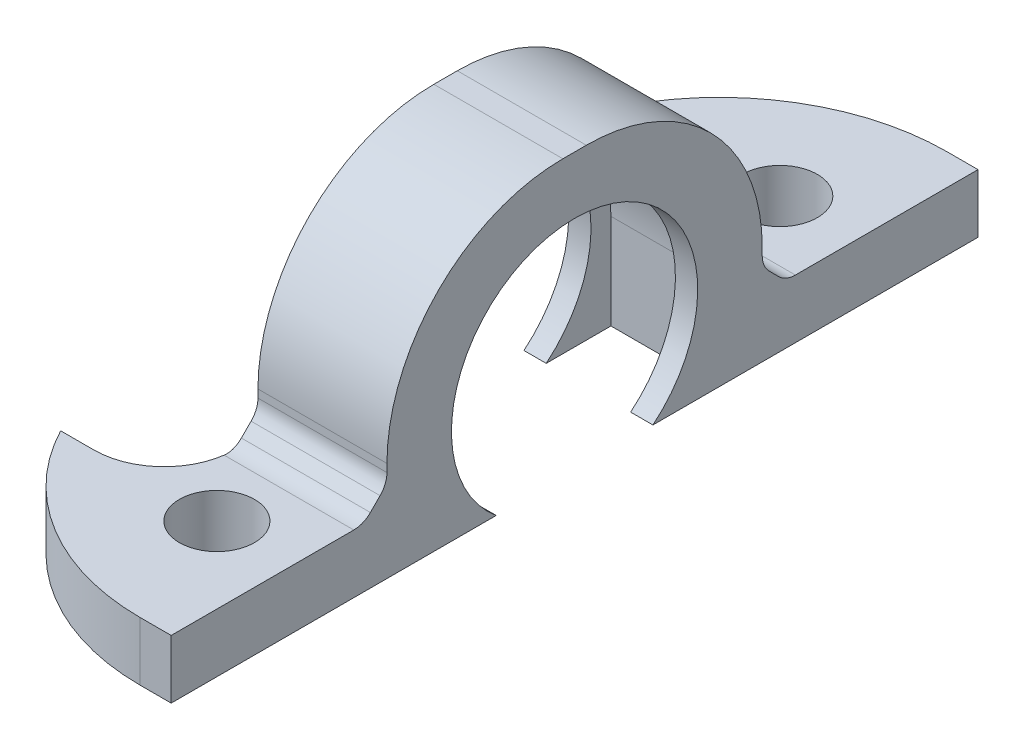
ISO-10303-21;
HEADER;
FILE_DESCRIPTION(('STEP AP214'),'2;1');
FILE_NAME('part.step','',(''),(''),'','','');
FILE_SCHEMA(('AUTOMOTIVE_DESIGN { 1 0 10303 214 1 1 1 1 }'));
ENDSEC;
DATA;
#1=APPLICATION_CONTEXT('core data for automotive mechanical design processes');
#2=APPLICATION_PROTOCOL_DEFINITION('international standard','automotive_design',2000,#1);
#3=PRODUCT_CONTEXT('',#1,'mechanical');
#4=PRODUCT('Part','Part','',(#3));
#5=PRODUCT_RELATED_PRODUCT_CATEGORY('part','',(#4));
#6=PRODUCT_DEFINITION_FORMATION('','',#4);
#7=PRODUCT_DEFINITION_CONTEXT('part definition',#1,'design');
#8=PRODUCT_DEFINITION('design','',#6,#7);
#9=PRODUCT_DEFINITION_SHAPE('','',#8);
#10=(LENGTH_UNIT() NAMED_UNIT(*) SI_UNIT(.MILLI.,.METRE.));
#11=(NAMED_UNIT(*) PLANE_ANGLE_UNIT() SI_UNIT($,.RADIAN.));
#12=(NAMED_UNIT(*) SI_UNIT($,.STERADIAN.) SOLID_ANGLE_UNIT());
#13=UNCERTAINTY_MEASURE_WITH_UNIT(LENGTH_MEASURE(1.E-05),#10,'distance_accuracy_value','');
#14=(GEOMETRIC_REPRESENTATION_CONTEXT(3) GLOBAL_UNCERTAINTY_ASSIGNED_CONTEXT((#13)) GLOBAL_UNIT_ASSIGNED_CONTEXT((#10,
#11,#12)) REPRESENTATION_CONTEXT('',''));
#15=CARTESIAN_POINT('',(0.,0.,0.));
#16=DIRECTION('',(0.,0.,1.));
#17=DIRECTION('',(1.,0.,0.));
#18=AXIS2_PLACEMENT_3D('',#15,#16,#17);
#19=CARTESIAN_POINT('',(0.,0.,0.));
#20=DIRECTION('',(0.,-1.,0.));
#21=DIRECTION('',(0.,0.,-1.));
#22=AXIS2_PLACEMENT_3D('',#19,#20,#21);
#23=PLANE('',#22);
#24=DIRECTION('',(1.,0.,0.));
#25=VECTOR('',#24,1.);
#26=CARTESIAN_POINT('',(-7.16273487383046,0.,-3.34065861769801));
#27=LINE('',#26,#25);
#28=CARTESIAN_POINT('',(-2.74999774788479,0.,-3.34065861769801));
#29=VERTEX_POINT('',#28);
#30=CARTESIAN_POINT('',(-1.8,0.,-3.34065861769801));
#31=VERTEX_POINT('',#30);
#32=EDGE_CURVE('E673',#29,#31,#27,.T.);
#33=ORIENTED_EDGE('',*,*,#32,.F.);
#34=DIRECTION('',(0.,0.,-1.));
#35=VECTOR('',#34,1.);
#36=CARTESIAN_POINT('',(-2.74999774788479,0.,0.));
#37=LINE('',#36,#35);
#38=CARTESIAN_POINT('',(-2.74999774788479,0.,-8.99999999999998));
#39=VERTEX_POINT('',#38);
#40=EDGE_CURVE('E613',#29,#39,#37,.T.);
#41=ORIENTED_EDGE('',*,*,#40,.T.);
#42=CARTESIAN_POINT('',(-5.74999774788479,0.,-9.));
#43=DIRECTION('',(0.,1.,0.));
#44=DIRECTION('',(0.,0.,1.));
#45=AXIS2_PLACEMENT_3D('',#42,#43,#44);
#46=CIRCLE('',#45,3.);
#47=CARTESIAN_POINT('',(-5.74999774788481,0.,-12.));
#48=VERTEX_POINT('',#47);
#49=EDGE_CURVE('E618',#39,#48,#46,.T.);
#50=ORIENTED_EDGE('',*,*,#49,.T.);
#51=DIRECTION('',(-1.,0.,0.));
#52=VECTOR('',#51,1.);
#53=CARTESIAN_POINT('',(0.,0.,-12.));
#54=LINE('',#53,#52);
#55=CARTESIAN_POINT('',(-7.16273487383046,0.,-12.));
#56=VERTEX_POINT('',#55);
#57=EDGE_CURVE('E467',#48,#56,#54,.T.);
#58=ORIENTED_EDGE('',*,*,#57,.T.);
#59=CARTESIAN_POINT('',(1.43028554974587,0.,-7.5));
#60=DIRECTION('',(0.,1.,0.));
#61=DIRECTION('',(0.,0.,1.));
#62=AXIS2_PLACEMENT_3D('',#59,#60,#61);
#63=CIRCLE('',#62,9.7);
#64=CARTESIAN_POINT('',(1.43028554974588,0.,-17.2));
#65=VERTEX_POINT('',#64);
#66=EDGE_CURVE('E557',#65,#56,#63,.T.);
#67=ORIENTED_EDGE('',*,*,#66,.F.);
#68=DIRECTION('',(-1.,0.,0.));
#69=VECTOR('',#68,1.);
#70=CARTESIAN_POINT('',(0.,0.,-17.2));
#71=LINE('',#70,#69);
#72=CARTESIAN_POINT('',(2.75,0.,-17.2));
#73=VERTEX_POINT('',#72);
#74=EDGE_CURVE('E560',#73,#65,#71,.T.);
#75=ORIENTED_EDGE('',*,*,#74,.F.);
#76=DIRECTION('',(0.,0.,-1.));
#77=VECTOR('',#76,1.);
#78=CARTESIAN_POINT('',(2.75,0.,0.));
#79=LINE('',#78,#77);
#80=CARTESIAN_POINT('',(2.75,0.,-3.34065861769801));
#81=VERTEX_POINT('',#80);
#82=EDGE_CURVE('E280',#81,#73,#79,.T.);
#83=ORIENTED_EDGE('',*,*,#82,.F.);
#84=CARTESIAN_POINT('',(1.8,0.,-3.34065861769801));
#85=VERTEX_POINT('',#84);
#86=EDGE_CURVE('E254',#85,#81,#27,.T.);
#87=ORIENTED_EDGE('',*,*,#86,.F.);
#88=DIRECTION('',(0.,0.,-1.));
#89=VECTOR('',#88,1.);
#90=CARTESIAN_POINT('',(1.8,0.,0.));
#91=LINE('',#90,#89);
#92=CARTESIAN_POINT('',(1.8,0.,-6.1));
#93=VERTEX_POINT('',#92);
#94=EDGE_CURVE('E709',#85,#93,#91,.T.);
#95=ORIENTED_EDGE('',*,*,#94,.T.);
#96=DIRECTION('',(1.,0.,0.));
#97=VECTOR('',#96,1.);
#98=CARTESIAN_POINT('',(-1.8,0.,-6.1));
#99=LINE('',#98,#97);
#100=CARTESIAN_POINT('',(-1.8,0.,-6.1));
#101=VERTEX_POINT('',#100);
#102=EDGE_CURVE('E714',#101,#93,#99,.T.);
#103=ORIENTED_EDGE('',*,*,#102,.F.);
#104=DIRECTION('',(0.,0.,-1.));
#105=VECTOR('',#104,1.);
#106=CARTESIAN_POINT('',(-1.8,0.,0.));
#107=LINE('',#106,#105);
#108=EDGE_CURVE('E677',#31,#101,#107,.T.);
#109=ORIENTED_EDGE('',*,*,#108,.F.);
#110=EDGE_LOOP('',(#33,#41,#50,#58,#67,#75,#83,#87,#95,#103,#109));
#111=FACE_BOUND('',#110,.T.);
#112=CARTESIAN_POINT('',(-0.5,0.,-12.));
#113=DIRECTION('',(0.,1.,0.));
#114=DIRECTION('',(0.,0.,1.));
#115=AXIS2_PLACEMENT_3D('',#112,#113,#114);
#116=CIRCLE('',#115,1.6);
#117=CARTESIAN_POINT('',(-0.5,0.,-10.4));
#118=VERTEX_POINT('',#117);
#119=EDGE_CURVE('E543',#118,#118,#116,.T.);
#120=ORIENTED_EDGE('',*,*,#119,.T.);
#121=EDGE_LOOP('',(#120));
#122=FACE_BOUND('',#121,.T.);
#123=ADVANCED_FACE('F49',(#111,#122),#23,.T.);
#124=DIRECTION('',(1.,0.,0.));
#125=VECTOR('',#124,1.);
#126=CARTESIAN_POINT('',(-7.16273487383046,0.,3.34065861769801));
#127=LINE('',#126,#125);
#128=CARTESIAN_POINT('',(2.75,0.,3.34065861769801));
#129=VERTEX_POINT('',#128);
#130=CARTESIAN_POINT('',(1.8,0.,3.34065861769801));
#131=VERTEX_POINT('',#130);
#132=EDGE_CURVE('E251',#129,#131,#127,.F.);
#133=ORIENTED_EDGE('',*,*,#132,.F.);
#134=CARTESIAN_POINT('',(2.75,0.,17.2));
#135=VERTEX_POINT('',#134);
#136=EDGE_CURVE('E267',#135,#129,#79,.T.);
#137=ORIENTED_EDGE('',*,*,#136,.F.);
#138=DIRECTION('',(1.,0.,0.));
#139=VECTOR('',#138,1.);
#140=CARTESIAN_POINT('',(0.,0.,17.2));
#141=LINE('',#140,#139);
#142=CARTESIAN_POINT('',(1.43028554974588,0.,17.2));
#143=VERTEX_POINT('',#142);
#144=EDGE_CURVE('E583',#143,#135,#141,.T.);
#145=ORIENTED_EDGE('',*,*,#144,.F.);
#146=CARTESIAN_POINT('',(1.43028554974588,0.,7.50000000000001));
#147=DIRECTION('',(0.,1.,0.));
#148=DIRECTION('',(0.,0.,1.));
#149=AXIS2_PLACEMENT_3D('',#146,#147,#148);
#150=CIRCLE('',#149,9.7);
#151=CARTESIAN_POINT('',(-7.16273487383046,0.,12.));
#152=VERTEX_POINT('',#151);
#153=EDGE_CURVE('E580',#152,#143,#150,.T.);
#154=ORIENTED_EDGE('',*,*,#153,.F.);
#155=DIRECTION('',(-1.,0.,0.));
#156=VECTOR('',#155,1.);
#157=CARTESIAN_POINT('',(0.,0.,12.));
#158=LINE('',#157,#156);
#159=CARTESIAN_POINT('',(-5.74999774788481,0.,12.));
#160=VERTEX_POINT('',#159);
#161=EDGE_CURVE('E605',#160,#152,#158,.T.);
#162=ORIENTED_EDGE('',*,*,#161,.F.);
#163=CARTESIAN_POINT('',(-5.74999774788479,0.,9.));
#164=DIRECTION('',(0.,1.,0.));
#165=DIRECTION('',(0.,0.,1.));
#166=AXIS2_PLACEMENT_3D('',#163,#164,#165);
#167=CIRCLE('',#166,3.);
#168=CARTESIAN_POINT('',(-2.74999774788479,0.,8.99999999999998));
#169=VERTEX_POINT('',#168);
#170=EDGE_CURVE('E609',#160,#169,#167,.T.);
#171=ORIENTED_EDGE('',*,*,#170,.T.);
#172=CARTESIAN_POINT('',(-2.74999774788479,0.,3.34065861769801));
#173=VERTEX_POINT('',#172);
#174=EDGE_CURVE('E614',#169,#173,#37,.T.);
#175=ORIENTED_EDGE('',*,*,#174,.T.);
#176=CARTESIAN_POINT('',(-1.8,0.,3.34065861769801));
#177=VERTEX_POINT('',#176);
#178=EDGE_CURVE('E272',#177,#173,#127,.F.);
#179=ORIENTED_EDGE('',*,*,#178,.F.);
#180=CARTESIAN_POINT('',(-1.8,0.,6.1));
#181=VERTEX_POINT('',#180);
#182=EDGE_CURVE('E693',#181,#177,#107,.T.);
#183=ORIENTED_EDGE('',*,*,#182,.F.);
#184=DIRECTION('',(1.,0.,0.));
#185=VECTOR('',#184,1.);
#186=CARTESIAN_POINT('',(-1.8,0.,6.1));
#187=LINE('',#186,#185);
#188=CARTESIAN_POINT('',(1.8,0.,6.1));
#189=VERTEX_POINT('',#188);
#190=EDGE_CURVE('E717',#181,#189,#187,.T.);
#191=ORIENTED_EDGE('',*,*,#190,.T.);
#192=EDGE_CURVE('E269',#189,#131,#91,.T.);
#193=ORIENTED_EDGE('',*,*,#192,.T.);
#194=EDGE_LOOP('',(#133,#137,#145,#154,#162,#171,#175,#179,#183,#191,#193));
#195=FACE_BOUND('',#194,.T.);
#196=CARTESIAN_POINT('',(-0.499999999999997,0.,12.));
#197=DIRECTION('',(0.,1.,0.));
#198=DIRECTION('',(0.,0.,1.));
#199=AXIS2_PLACEMENT_3D('',#196,#197,#198);
#200=CIRCLE('',#199,1.6);
#201=CARTESIAN_POINT('',(-0.499999999999997,0.,13.6));
#202=VERTEX_POINT('',#201);
#203=EDGE_CURVE('E550',#202,#202,#200,.F.);
#204=ORIENTED_EDGE('',*,*,#203,.F.);
#205=EDGE_LOOP('',(#204));
#206=FACE_BOUND('',#205,.T.);
#207=ADVANCED_FACE('F264',(#195,#206),#23,.T.);
#208=CARTESIAN_POINT('',(-21.231407326161,4.05,0.));
#209=DIRECTION('',(1.,0.,0.));
#210=DIRECTION('',(0.,0.,-1.));
#211=AXIS2_PLACEMENT_3D('',#208,#209,#210);
#212=CYLINDRICAL_SURFACE('',#211,5.25);
#213=CARTESIAN_POINT('',(-1.8,4.05,0.));
#214=DIRECTION('',(1.,0.,0.));
#215=DIRECTION('',(0.,0.,-1.));
#216=AXIS2_PLACEMENT_3D('',#213,#214,#215);
#217=CIRCLE('',#216,5.25);
#218=EDGE_CURVE('E284',#177,#31,#217,.F.);
#219=ORIENTED_EDGE('',*,*,#218,.F.);
#220=ORIENTED_EDGE('',*,*,#178,.T.);
#221=CARTESIAN_POINT('',(-2.74999774788479,4.05,0.));
#222=DIRECTION('',(1.,0.,0.));
#223=DIRECTION('',(0.,0.,-1.));
#224=AXIS2_PLACEMENT_3D('',#221,#222,#223);
#225=CIRCLE('',#224,5.25);
#226=EDGE_CURVE('E514',#173,#29,#225,.F.);
#227=ORIENTED_EDGE('',*,*,#226,.T.);
#228=ORIENTED_EDGE('',*,*,#32,.T.);
#229=EDGE_LOOP('',(#219,#220,#227,#228));
#230=FACE_BOUND('',#229,.T.);
#231=ADVANCED_FACE('F384',(#230),#212,.F.);
#232=CARTESIAN_POINT('',(0.,2.5,0.));
#233=DIRECTION('',(0.,-1.,0.));
#234=DIRECTION('',(0.,0.,-1.));
#235=AXIS2_PLACEMENT_3D('',#232,#233,#234);
#236=PLANE('',#235);
#237=CARTESIAN_POINT('',(-0.499999999999997,2.5,12.));
#238=DIRECTION('',(0.,1.,0.));
#239=DIRECTION('',(0.,0.,1.));
#240=AXIS2_PLACEMENT_3D('',#237,#238,#239);
#241=CIRCLE('',#240,1.6);
#242=CARTESIAN_POINT('',(-0.499999999999997,2.5,13.6));
#243=VERTEX_POINT('',#242);
#244=EDGE_CURVE('E516',#243,#243,#241,.F.);
#245=ORIENTED_EDGE('',*,*,#244,.T.);
#246=EDGE_LOOP('',(#245));
#247=FACE_BOUND('',#246,.T.);
#248=DIRECTION('',(0.,0.,-1.));
#249=VECTOR('',#248,1.);
#250=CARTESIAN_POINT('',(2.75,2.5,0.));
#251=LINE('',#250,#249);
#252=CARTESIAN_POINT('',(2.75,2.5,17.2));
#253=VERTEX_POINT('',#252);
#254=CARTESIAN_POINT('',(2.75,2.5,9.4142135623731));
#255=VERTEX_POINT('',#254);
#256=EDGE_CURVE('E286',#253,#255,#251,.T.);
#257=ORIENTED_EDGE('',*,*,#256,.T.);
#258=DIRECTION('',(1.,0.,0.));
#259=VECTOR('',#258,1.);
#260=CARTESIAN_POINT('',(-2.74999774788479,2.5,9.4142135623731));
#261=LINE('',#260,#259);
#262=CARTESIAN_POINT('',(-2.77873082538419,2.5,9.4142135623731));
#263=VERTEX_POINT('',#262);
#264=EDGE_CURVE('E332',#255,#263,#261,.F.);
#265=ORIENTED_EDGE('',*,*,#264,.T.);
#266=CARTESIAN_POINT('',(-5.74999774788479,2.5,9.));
#267=DIRECTION('',(0.,1.,0.));
#268=DIRECTION('',(0.,0.,1.));
#269=AXIS2_PLACEMENT_3D('',#266,#267,#268);
#270=CIRCLE('',#269,3.);
#271=CARTESIAN_POINT('',(-5.74999774788481,2.5,12.));
#272=VERTEX_POINT('',#271);
#273=EDGE_CURVE('E468',#272,#263,#270,.T.);
#274=ORIENTED_EDGE('',*,*,#273,.F.);
#275=DIRECTION('',(-1.,0.,0.));
#276=VECTOR('',#275,1.);
#277=CARTESIAN_POINT('',(0.,2.5,12.));
#278=LINE('',#277,#276);
#279=CARTESIAN_POINT('',(-7.16273487383046,2.5,12.));
#280=VERTEX_POINT('',#279);
#281=EDGE_CURVE('E625',#272,#280,#278,.T.);
#282=ORIENTED_EDGE('',*,*,#281,.T.);
#283=CARTESIAN_POINT('',(1.43028554974588,2.5,7.50000000000001));
#284=DIRECTION('',(0.,1.,0.));
#285=DIRECTION('',(0.,0.,1.));
#286=AXIS2_PLACEMENT_3D('',#283,#284,#285);
#287=CIRCLE('',#286,9.7);
#288=CARTESIAN_POINT('',(1.43028554974588,2.5,17.2));
#289=VERTEX_POINT('',#288);
#290=EDGE_CURVE('E547',#280,#289,#287,.T.);
#291=ORIENTED_EDGE('',*,*,#290,.T.);
#292=DIRECTION('',(1.,0.,0.));
#293=VECTOR('',#292,1.);
#294=CARTESIAN_POINT('',(0.,2.5,17.2));
#295=LINE('',#294,#293);
#296=EDGE_CURVE('E584',#289,#253,#295,.T.);
#297=ORIENTED_EDGE('',*,*,#296,.T.);
#298=EDGE_LOOP('',(#257,#265,#274,#282,#291,#297));
#299=FACE_BOUND('',#298,.T.);
#300=ADVANCED_FACE('F388',(#247,#299),#236,.F.);
#301=CARTESIAN_POINT('',(-0.5,2.5,-12.));
#302=DIRECTION('',(0.,1.,0.));
#303=DIRECTION('',(0.,0.,1.));
#304=AXIS2_PLACEMENT_3D('',#301,#302,#303);
#305=CIRCLE('',#304,1.6);
#306=CARTESIAN_POINT('',(-0.5,2.5,-10.4));
#307=VERTEX_POINT('',#306);
#308=EDGE_CURVE('E456',#307,#307,#305,.T.);
#309=ORIENTED_EDGE('',*,*,#308,.F.);
#310=EDGE_LOOP('',(#309));
#311=FACE_BOUND('',#310,.T.);
#312=CARTESIAN_POINT('',(-5.74999774788479,2.5,-9.));
#313=DIRECTION('',(0.,1.,0.));
#314=DIRECTION('',(0.,0.,1.));
#315=AXIS2_PLACEMENT_3D('',#312,#313,#314);
#316=CIRCLE('',#315,3.);
#317=CARTESIAN_POINT('',(-2.77873082538419,2.5,-9.4142135623731));
#318=VERTEX_POINT('',#317);
#319=CARTESIAN_POINT('',(-5.74999774788481,2.5,-12.));
#320=VERTEX_POINT('',#319);
#321=EDGE_CURVE('E459',#318,#320,#316,.T.);
#322=ORIENTED_EDGE('',*,*,#321,.F.);
#323=DIRECTION('',(1.,0.,0.));
#324=VECTOR('',#323,1.);
#325=CARTESIAN_POINT('',(2.75,2.5,-9.4142135623731));
#326=LINE('',#325,#324);
#327=CARTESIAN_POINT('',(2.75,2.5,-9.4142135623731));
#328=VERTEX_POINT('',#327);
#329=EDGE_CURVE('E308',#318,#328,#326,.T.);
#330=ORIENTED_EDGE('',*,*,#329,.T.);
#331=CARTESIAN_POINT('',(2.75,2.5,-17.2));
#332=VERTEX_POINT('',#331);
#333=EDGE_CURVE('E476',#328,#332,#251,.T.);
#334=ORIENTED_EDGE('',*,*,#333,.T.);
#335=DIRECTION('',(-1.,0.,0.));
#336=VECTOR('',#335,1.);
#337=CARTESIAN_POINT('',(0.,2.5,-17.2));
#338=LINE('',#337,#336);
#339=CARTESIAN_POINT('',(1.43028554974588,2.5,-17.2));
#340=VERTEX_POINT('',#339);
#341=EDGE_CURVE('E561',#332,#340,#338,.T.);
#342=ORIENTED_EDGE('',*,*,#341,.T.);
#343=CARTESIAN_POINT('',(1.43028554974587,2.5,-7.5));
#344=DIRECTION('',(0.,1.,0.));
#345=DIRECTION('',(0.,0.,1.));
#346=AXIS2_PLACEMENT_3D('',#343,#344,#345);
#347=CIRCLE('',#346,9.7);
#348=CARTESIAN_POINT('',(-7.16273487383046,2.5,-12.));
#349=VERTEX_POINT('',#348);
#350=EDGE_CURVE('E565',#340,#349,#347,.T.);
#351=ORIENTED_EDGE('',*,*,#350,.T.);
#352=DIRECTION('',(-1.,0.,0.));
#353=VECTOR('',#352,1.);
#354=CARTESIAN_POINT('',(0.,2.5,-12.));
#355=LINE('',#354,#353);
#356=EDGE_CURVE('E464',#320,#349,#355,.T.);
#357=ORIENTED_EDGE('',*,*,#356,.F.);
#358=EDGE_LOOP('',(#322,#330,#334,#342,#351,#357));
#359=FACE_BOUND('',#358,.T.);
#360=ADVANCED_FACE('F443',(#311,#359),#236,.F.);
#361=CARTESIAN_POINT('',(2.75,2.5,0.));
#362=DIRECTION('',(-1.,0.,0.));
#363=DIRECTION('',(0.,0.,1.));
#364=AXIS2_PLACEMENT_3D('',#361,#362,#363);
#365=PLANE('',#364);
#366=CARTESIAN_POINT('',(2.75,4.05,0.));
#367=DIRECTION('',(1.,0.,0.));
#368=DIRECTION('',(0.,0.,-1.));
#369=AXIS2_PLACEMENT_3D('',#366,#367,#368);
#370=CIRCLE('',#369,5.25);
#371=EDGE_CURVE('E248',#81,#129,#370,.T.);
#372=ORIENTED_EDGE('',*,*,#371,.F.);
#373=ORIENTED_EDGE('',*,*,#82,.T.);
#374=DIRECTION('',(0.,1.,0.));
#375=VECTOR('',#374,1.);
#376=CARTESIAN_POINT('',(2.75,0.,-17.2));
#377=LINE('',#376,#375);
#378=EDGE_CURVE('E575',#73,#332,#377,.T.);
#379=ORIENTED_EDGE('',*,*,#378,.T.);
#380=ORIENTED_EDGE('',*,*,#333,.F.);
#381=CARTESIAN_POINT('',(2.75,3.5,-9.4142135623731));
#382=DIRECTION('',(-1.,0.,0.));
#383=DIRECTION('',(0.,0.,1.));
#384=AXIS2_PLACEMENT_3D('',#381,#382,#383);
#385=CIRCLE('',#384,1.);
#386=CARTESIAN_POINT('',(2.75,2.79289321881345,-8.70710678118656));
#387=VERTEX_POINT('',#386);
#388=EDGE_CURVE('E336',#328,#387,#385,.T.);
#389=ORIENTED_EDGE('',*,*,#388,.T.);
#390=DIRECTION('',(0.,0.707106781186545,0.70710678118655));
#391=VECTOR('',#390,1.);
#392=CARTESIAN_POINT('',(2.75,7.,-4.49999999999998));
#393=LINE('',#392,#391);
#394=CARTESIAN_POINT('',(2.75,3.20710678118654,-8.29289321881346));
#395=VERTEX_POINT('',#394);
#396=EDGE_CURVE('E300',#387,#395,#393,.T.);
#397=ORIENTED_EDGE('',*,*,#396,.T.);
#398=CARTESIAN_POINT('',(2.75,3.91421356237309,-9.));
#399=DIRECTION('',(-1.,0.,0.));
#400=DIRECTION('',(0.,0.,1.));
#401=AXIS2_PLACEMENT_3D('',#398,#399,#400);
#402=CIRCLE('',#401,1.);
#403=CARTESIAN_POINT('',(2.75,3.91421356237309,-8.));
#404=VERTEX_POINT('',#403);
#405=EDGE_CURVE('E421',#395,#404,#402,.T.);
#406=ORIENTED_EDGE('',*,*,#405,.T.);
#407=DIRECTION('',(0.,1.,0.));
#408=VECTOR('',#407,1.);
#409=CARTESIAN_POINT('',(2.75,0.,-8.));
#410=LINE('',#409,#408);
#411=CARTESIAN_POINT('',(2.75,4.25000000000001,-8.));
#412=VERTEX_POINT('',#411);
#413=EDGE_CURVE('E259',#404,#412,#410,.T.);
#414=ORIENTED_EDGE('',*,*,#413,.T.);
#415=CARTESIAN_POINT('',(2.75,4.25000000000001,-0.500000000000004));
#416=DIRECTION('',(1.,0.,0.));
#417=DIRECTION('',(0.,0.,-1.));
#418=AXIS2_PLACEMENT_3D('',#415,#416,#417);
#419=CIRCLE('',#418,7.5);
#420=CARTESIAN_POINT('',(2.75,11.75,-0.500000000000003));
#421=VERTEX_POINT('',#420);
#422=EDGE_CURVE('E520',#412,#421,#419,.T.);
#423=ORIENTED_EDGE('',*,*,#422,.T.);
#424=DIRECTION('',(0.,0.,1.));
#425=VECTOR('',#424,1.);
#426=CARTESIAN_POINT('',(2.75,11.75,0.));
#427=LINE('',#426,#425);
#428=CARTESIAN_POINT('',(2.75,11.75,0.500000000000005));
#429=VERTEX_POINT('',#428);
#430=EDGE_CURVE('E524',#421,#429,#427,.T.);
#431=ORIENTED_EDGE('',*,*,#430,.T.);
#432=CARTESIAN_POINT('',(2.75,4.25000000000001,0.500000000000004));
#433=DIRECTION('',(1.,0.,0.));
#434=DIRECTION('',(0.,0.,-1.));
#435=AXIS2_PLACEMENT_3D('',#432,#433,#434);
#436=CIRCLE('',#435,7.5);
#437=CARTESIAN_POINT('',(2.75,4.25000000000001,8.));
#438=VERTEX_POINT('',#437);
#439=EDGE_CURVE('E528',#438,#429,#436,.F.);
#440=ORIENTED_EDGE('',*,*,#439,.F.);
#441=DIRECTION('',(0.,1.,0.));
#442=VECTOR('',#441,1.);
#443=CARTESIAN_POINT('',(2.75,0.,8.00000000000001));
#444=LINE('',#443,#442);
#445=CARTESIAN_POINT('',(2.75,3.9142135623731,8.));
#446=VERTEX_POINT('',#445);
#447=EDGE_CURVE('E532',#446,#438,#444,.T.);
#448=ORIENTED_EDGE('',*,*,#447,.F.);
#449=CARTESIAN_POINT('',(2.75,3.9142135623731,9.));
#450=DIRECTION('',(-1.,0.,0.));
#451=DIRECTION('',(0.,0.,1.));
#452=AXIS2_PLACEMENT_3D('',#449,#450,#451);
#453=CIRCLE('',#452,1.);
#454=CARTESIAN_POINT('',(2.75,3.20710678118656,8.29289321881345));
#455=VERTEX_POINT('',#454);
#456=EDGE_CURVE('E412',#446,#455,#453,.T.);
#457=ORIENTED_EDGE('',*,*,#456,.T.);
#458=DIRECTION('',(0.,0.707106781186551,-0.707106781186544));
#459=VECTOR('',#458,1.);
#460=CARTESIAN_POINT('',(2.75,7.,4.50000000000005));
#461=LINE('',#460,#459);
#462=CARTESIAN_POINT('',(2.75,2.79289321881345,8.70710678118655));
#463=VERTEX_POINT('',#462);
#464=EDGE_CURVE('E292',#455,#463,#461,.F.);
#465=ORIENTED_EDGE('',*,*,#464,.T.);
#466=CARTESIAN_POINT('',(2.75,3.5,9.4142135623731));
#467=DIRECTION('',(-1.,0.,0.));
#468=DIRECTION('',(0.,0.,1.));
#469=AXIS2_PLACEMENT_3D('',#466,#467,#468);
#470=CIRCLE('',#469,1.);
#471=EDGE_CURVE('E11',#463,#255,#470,.T.);
#472=ORIENTED_EDGE('',*,*,#471,.T.);
#473=ORIENTED_EDGE('',*,*,#256,.F.);
#474=DIRECTION('',(0.,1.,0.));
#475=VECTOR('',#474,1.);
#476=CARTESIAN_POINT('',(2.75,0.,17.2));
#477=LINE('',#476,#475);
#478=EDGE_CURVE('E277',#135,#253,#477,.T.);
#479=ORIENTED_EDGE('',*,*,#478,.F.);
#480=ORIENTED_EDGE('',*,*,#136,.T.);
#481=EDGE_LOOP('',(#372,#373,#379,#380,#389,#397,#406,#414,#423,#431,#440,#448,#457,#465,#472,
#473,#479,#480));
#482=FACE_BOUND('',#481,.T.);
#483=ADVANCED_FACE('F275',(#482),#365,.F.);
#484=CARTESIAN_POINT('',(0.,0.,-12.));
#485=DIRECTION('',(0.,0.,-1.));
#486=DIRECTION('',(-1.,0.,0.));
#487=AXIS2_PLACEMENT_3D('',#484,#485,#486);
#488=PLANE('',#487);
#489=DIRECTION('',(0.,1.,0.));
#490=VECTOR('',#489,1.);
#491=CARTESIAN_POINT('',(-7.16273487383046,0.,-12.));
#492=LINE('',#491,#490);
#493=EDGE_CURVE('E572',#56,#349,#492,.T.);
#494=ORIENTED_EDGE('',*,*,#493,.F.);
#495=ORIENTED_EDGE('',*,*,#57,.F.);
#496=DIRECTION('',(0.,1.,0.));
#497=VECTOR('',#496,1.);
#498=CARTESIAN_POINT('',(-5.74999774788481,0.,-12.));
#499=LINE('',#498,#497);
#500=EDGE_CURVE('E632',#48,#320,#499,.T.);
#501=ORIENTED_EDGE('',*,*,#500,.T.);
#502=ORIENTED_EDGE('',*,*,#356,.T.);
#503=EDGE_LOOP('',(#494,#495,#501,#502));
#504=FACE_BOUND('',#503,.T.);
#505=ADVANCED_FACE('F438',(#504),#488,.F.);
#506=CARTESIAN_POINT('',(0.,0.,12.));
#507=DIRECTION('',(0.,0.,-1.));
#508=DIRECTION('',(-1.,0.,0.));
#509=AXIS2_PLACEMENT_3D('',#506,#507,#508);
#510=PLANE('',#509);
#511=ORIENTED_EDGE('',*,*,#161,.T.);
#512=DIRECTION('',(0.,1.,0.));
#513=VECTOR('',#512,1.);
#514=CARTESIAN_POINT('',(-7.16273487383046,0.,12.));
#515=LINE('',#514,#513);
#516=EDGE_CURVE('E587',#152,#280,#515,.T.);
#517=ORIENTED_EDGE('',*,*,#516,.T.);
#518=ORIENTED_EDGE('',*,*,#281,.F.);
#519=DIRECTION('',(0.,1.,0.));
#520=VECTOR('',#519,1.);
#521=CARTESIAN_POINT('',(-5.74999774788481,0.,12.));
#522=LINE('',#521,#520);
#523=EDGE_CURVE('E622',#160,#272,#522,.T.);
#524=ORIENTED_EDGE('',*,*,#523,.F.);
#525=EDGE_LOOP('',(#511,#517,#518,#524));
#526=FACE_BOUND('',#525,.T.);
#527=ADVANCED_FACE('F435',(#526),#510,.T.);
#528=CARTESIAN_POINT('',(-5.74999774788479,0.,-9.));
#529=DIRECTION('',(0.,1.,0.));
#530=DIRECTION('',(0.,0.,1.));
#531=AXIS2_PLACEMENT_3D('',#528,#529,#530);
#532=CYLINDRICAL_SURFACE('',#531,3.);
#533=DIRECTION('',(0.,1.,0.));
#534=VECTOR('',#533,1.);
#535=CARTESIAN_POINT('',(-2.74999774788479,0.,-8.99999999999998));
#536=LINE('',#535,#534);
#537=CARTESIAN_POINT('',(-2.74999774788479,2.58982027887556,-8.99999999999998));
#538=VERTEX_POINT('',#537);
#539=EDGE_CURVE('E74',#39,#538,#536,.T.);
#540=ORIENTED_EDGE('',*,*,#539,.T.);
#541=CARTESIAN_POINT('',(-2.74999774788479,2.58982027887556,-8.99999999999998));
#542=CARTESIAN_POINT('',(-2.74999703591385,2.57857202399816,-9.02471908296438));
#543=CARTESIAN_POINT('',(-2.75030390506255,2.56833726646305,-9.04987996620787));
#544=CARTESIAN_POINT('',(-2.75158762653605,2.54994588208396,-9.10094720808658));
#545=CARTESIAN_POINT('',(-2.75256480781377,2.54179027827271,-9.12685392675452));
#546=CARTESIAN_POINT('',(-2.75653102026084,2.52081283331663,-9.20441764793361));
#547=CARTESIAN_POINT('',(-2.76055094635439,2.51103488237344,-9.25690341327108));
#548=CARTESIAN_POINT('',(-2.76781554487511,2.50366007592195,-9.32695370270162));
#549=CARTESIAN_POINT('',(-2.76977282896997,2.50229166304731,-9.34433721280884));
#550=CARTESIAN_POINT('',(-2.77401065034294,2.50045953346966,-9.37922232432684));
#551=CARTESIAN_POINT('',(-2.77629311779519,2.50000148231471,-9.39672398927624));
#552=CARTESIAN_POINT('',(-2.77873082538419,2.5,-9.4142135623731));
#553=B_SPLINE_CURVE_WITH_KNOTS('',3,(#541,#542,#543,#544,#545,#546,#547,#548,#549,#550,#551,
#552),.UNSPECIFIED.,.F.,.F.,(4,2,2,2,2,4),(0.,0.081413798583449,0.162867579262306,
0.322570859575194,0.375194587434809,0.428144801085928),.UNSPECIFIED.);
#554=EDGE_CURVE('E342',#538,#318,#553,.T.);
#555=ORIENTED_EDGE('',*,*,#554,.T.);
#556=ORIENTED_EDGE('',*,*,#321,.T.);
#557=ORIENTED_EDGE('',*,*,#500,.F.);
#558=ORIENTED_EDGE('',*,*,#49,.F.);
#559=EDGE_LOOP('',(#540,#555,#556,#557,#558));
#560=FACE_BOUND('',#559,.T.);
#561=ADVANCED_FACE('F353',(#560),#532,.F.);
#562=CARTESIAN_POINT('',(-2.74999774788479,0.,0.));
#563=DIRECTION('',(1.,0.,0.));
#564=DIRECTION('',(0.,0.,-1.));
#565=AXIS2_PLACEMENT_3D('',#562,#563,#564);
#566=PLANE('',#565);
#567=ORIENTED_EDGE('',*,*,#226,.F.);
#568=ORIENTED_EDGE('',*,*,#174,.F.);
#569=DIRECTION('',(0.,1.,0.));
#570=VECTOR('',#569,1.);
#571=CARTESIAN_POINT('',(-2.74999774788479,0.,8.99999999999998));
#572=LINE('',#571,#570);
#573=CARTESIAN_POINT('',(-2.74999774788479,2.58982027887556,8.99999999999998));
#574=VERTEX_POINT('',#573);
#575=EDGE_CURVE('E66',#169,#574,#572,.T.);
#576=ORIENTED_EDGE('',*,*,#575,.T.);
#577=CARTESIAN_POINT('',(-2.74999774788479,3.5,9.4142135623731));
#578=DIRECTION('',(1.,0.,0.));
#579=DIRECTION('',(0.,0.,-1.));
#580=AXIS2_PLACEMENT_3D('',#577,#578,#579);
#581=CIRCLE('',#580,1.);
#582=CARTESIAN_POINT('',(-2.74999774788479,2.79289321881345,8.70710678118655));
#583=VERTEX_POINT('',#582);
#584=EDGE_CURVE('E59',#574,#583,#581,.T.);
#585=ORIENTED_EDGE('',*,*,#584,.T.);
#586=DIRECTION('',(0.,-0.707106781186551,0.707106781186544));
#587=VECTOR('',#586,1.);
#588=CARTESIAN_POINT('',(-2.74999774788479,5.74999999999999,5.75000000000005));
#589=LINE('',#588,#587);
#590=CARTESIAN_POINT('',(-2.74999774788479,3.20710678118656,8.29289321881345));
#591=VERTEX_POINT('',#590);
#592=EDGE_CURVE('E296',#583,#591,#589,.F.);
#593=ORIENTED_EDGE('',*,*,#592,.T.);
#594=CARTESIAN_POINT('',(-2.74999774788479,3.9142135623731,9.));
#595=DIRECTION('',(1.,0.,0.));
#596=DIRECTION('',(0.,0.,-1.));
#597=AXIS2_PLACEMENT_3D('',#594,#595,#596);
#598=CIRCLE('',#597,1.);
#599=CARTESIAN_POINT('',(-2.74999774788479,3.9142135623731,8.));
#600=VERTEX_POINT('',#599);
#601=EDGE_CURVE('E413',#591,#600,#598,.T.);
#602=ORIENTED_EDGE('',*,*,#601,.T.);
#603=DIRECTION('',(0.,-1.,0.));
#604=VECTOR('',#603,1.);
#605=CARTESIAN_POINT('',(-2.74999774788479,0.,8.00000000000001));
#606=LINE('',#605,#604);
#607=CARTESIAN_POINT('',(-2.74999774788479,4.25000000000001,8.));
#608=VERTEX_POINT('',#607);
#609=EDGE_CURVE('E511',#608,#600,#606,.T.);
#610=ORIENTED_EDGE('',*,*,#609,.F.);
#611=CARTESIAN_POINT('',(-2.74999774788479,4.25000000000001,0.500000000000004));
#612=DIRECTION('',(1.,0.,0.));
#613=DIRECTION('',(0.,0.,-1.));
#614=AXIS2_PLACEMENT_3D('',#611,#612,#613);
#615=CIRCLE('',#614,7.5);
#616=CARTESIAN_POINT('',(-2.74999774788479,11.75,0.500000000000005));
#617=VERTEX_POINT('',#616);
#618=EDGE_CURVE('E507',#617,#608,#615,.T.);
#619=ORIENTED_EDGE('',*,*,#618,.F.);
#620=DIRECTION('',(0.,0.,-1.));
#621=VECTOR('',#620,1.);
#622=CARTESIAN_POINT('',(-2.74999774788479,11.75,0.));
#623=LINE('',#622,#621);
#624=CARTESIAN_POINT('',(-2.74999774788479,11.75,-0.500000000000003));
#625=VERTEX_POINT('',#624);
#626=EDGE_CURVE('E496',#617,#625,#623,.T.);
#627=ORIENTED_EDGE('',*,*,#626,.T.);
#628=CARTESIAN_POINT('',(-2.74999774788479,4.25000000000001,-0.500000000000004));
#629=DIRECTION('',(1.,0.,0.));
#630=DIRECTION('',(0.,0.,-1.));
#631=AXIS2_PLACEMENT_3D('',#628,#629,#630);
#632=CIRCLE('',#631,7.5);
#633=CARTESIAN_POINT('',(-2.74999774788479,4.25000000000001,-8.));
#634=VERTEX_POINT('',#633);
#635=EDGE_CURVE('E487',#625,#634,#632,.F.);
#636=ORIENTED_EDGE('',*,*,#635,.T.);
#637=DIRECTION('',(0.,-1.,0.));
#638=VECTOR('',#637,1.);
#639=CARTESIAN_POINT('',(-2.74999774788479,0.,-8.));
#640=LINE('',#639,#638);
#641=CARTESIAN_POINT('',(-2.74999774788479,3.91421356237309,-8.));
#642=VERTEX_POINT('',#641);
#643=EDGE_CURVE('E485',#634,#642,#640,.T.);
#644=ORIENTED_EDGE('',*,*,#643,.T.);
#645=CARTESIAN_POINT('',(-2.74999774788479,3.91421356237309,-9.));
#646=DIRECTION('',(1.,0.,0.));
#647=DIRECTION('',(0.,0.,-1.));
#648=AXIS2_PLACEMENT_3D('',#645,#646,#647);
#649=CIRCLE('',#648,1.);
#650=CARTESIAN_POINT('',(-2.74999774788479,3.20710678118655,-8.29289321881346));
#651=VERTEX_POINT('',#650);
#652=EDGE_CURVE('E351',#642,#651,#649,.T.);
#653=ORIENTED_EDGE('',*,*,#652,.T.);
#654=DIRECTION('',(0.,-0.707106781186545,-0.70710678118655));
#655=VECTOR('',#654,1.);
#656=CARTESIAN_POINT('',(-2.74999774788479,5.75000000000001,-5.74999999999998));
#657=LINE('',#656,#655);
#658=CARTESIAN_POINT('',(-2.74999774788479,2.79289321881345,-8.70710678118656));
#659=VERTEX_POINT('',#658);
#660=EDGE_CURVE('E304',#651,#659,#657,.T.);
#661=ORIENTED_EDGE('',*,*,#660,.T.);
#662=CARTESIAN_POINT('',(-2.74999774788479,3.5,-9.4142135623731));
#663=DIRECTION('',(1.,0.,0.));
#664=DIRECTION('',(0.,0.,-1.));
#665=AXIS2_PLACEMENT_3D('',#662,#663,#664);
#666=CIRCLE('',#665,1.);
#667=EDGE_CURVE('E339',#659,#538,#666,.T.);
#668=ORIENTED_EDGE('',*,*,#667,.T.);
#669=ORIENTED_EDGE('',*,*,#539,.F.);
#670=ORIENTED_EDGE('',*,*,#40,.F.);
#671=EDGE_LOOP('',(#567,#568,#576,#585,#593,#602,#610,#619,#627,#636,#644,#653,#661,#668,#669,#670));
#672=FACE_BOUND('',#671,.T.);
#673=ADVANCED_FACE('F433',(#672),#566,.F.);
#674=CARTESIAN_POINT('',(-5.74999774788479,0.,9.));
#675=DIRECTION('',(0.,1.,0.));
#676=DIRECTION('',(0.,0.,1.));
#677=AXIS2_PLACEMENT_3D('',#674,#675,#676);
#678=CYLINDRICAL_SURFACE('',#677,3.);
#679=ORIENTED_EDGE('',*,*,#273,.T.);
#680=CARTESIAN_POINT('',(-2.77873082538419,2.5,9.4142135623731));
#681=CARTESIAN_POINT('',(-2.77497967540574,2.50000097443121,9.38731593281228));
#682=CARTESIAN_POINT('',(-2.77159962130362,2.50108648535787,9.36038425779276));
#683=CARTESIAN_POINT('',(-2.7655835960917,2.50544000793065,9.30660129880486));
#684=CARTESIAN_POINT('',(-2.76294798746065,2.50870908017936,9.27975006027568));
#685=CARTESIAN_POINT('',(-2.75625451444963,2.52163847983522,9.20063032028362));
#686=CARTESIAN_POINT('',(-2.7532627091942,2.53442171082178,9.14872493651284));
#687=CARTESIAN_POINT('',(-2.75105997951383,2.55678176934388,9.08157286952257));
#688=CARTESIAN_POINT('',(-2.75065899915052,2.56276164932803,9.06508136193662));
#689=CARTESIAN_POINT('',(-2.75012730536655,2.57562167633422,9.03233047437728));
#690=CARTESIAN_POINT('',(-2.74999828399174,2.58250717807801,9.01607316907888));
#691=CARTESIAN_POINT('',(-2.74999774788479,2.58982027887556,8.99999999999998));
#692=B_SPLINE_CURVE_WITH_KNOTS('',3,(#680,#681,#682,#683,#684,#685,#686,#687,#688,#689,#690,
#691),.UNSPECIFIED.,.F.,.F.,(4,2,2,2,2,4),(0.,0.0814139077702345,0.162867388806342,
0.3225709870069,0.375194689615942,0.428144845998397),.UNSPECIFIED.);
#693=EDGE_CURVE('E416',#263,#574,#692,.T.);
#694=ORIENTED_EDGE('',*,*,#693,.T.);
#695=ORIENTED_EDGE('',*,*,#575,.F.);
#696=ORIENTED_EDGE('',*,*,#170,.F.);
#697=ORIENTED_EDGE('',*,*,#523,.T.);
#698=EDGE_LOOP('',(#679,#694,#695,#696,#697));
#699=FACE_BOUND('',#698,.T.);
#700=ADVANCED_FACE('F428',(#699),#678,.F.);
#701=CARTESIAN_POINT('',(1.43028554974588,0.,7.50000000000001));
#702=DIRECTION('',(0.,1.,0.));
#703=DIRECTION('',(0.,0.,1.));
#704=AXIS2_PLACEMENT_3D('',#701,#702,#703);
#705=CYLINDRICAL_SURFACE('',#704,9.7);
#706=ORIENTED_EDGE('',*,*,#290,.F.);
#707=ORIENTED_EDGE('',*,*,#516,.F.);
#708=ORIENTED_EDGE('',*,*,#153,.T.);
#709=DIRECTION('',(0.,1.,0.));
#710=VECTOR('',#709,1.);
#711=CARTESIAN_POINT('',(1.43028554974588,0.,17.2));
#712=LINE('',#711,#710);
#713=EDGE_CURVE('E568',#143,#289,#712,.T.);
#714=ORIENTED_EDGE('',*,*,#713,.T.);
#715=EDGE_LOOP('',(#706,#707,#708,#714));
#716=FACE_BOUND('',#715,.T.);
#717=ADVANCED_FACE('F432',(#716),#705,.T.);
#718=CARTESIAN_POINT('',(0.,0.,17.2));
#719=DIRECTION('',(0.,0.,1.));
#720=DIRECTION('',(1.,0.,0.));
#721=AXIS2_PLACEMENT_3D('',#718,#719,#720);
#722=PLANE('',#721);
#723=ORIENTED_EDGE('',*,*,#296,.F.);
#724=ORIENTED_EDGE('',*,*,#713,.F.);
#725=ORIENTED_EDGE('',*,*,#144,.T.);
#726=ORIENTED_EDGE('',*,*,#478,.T.);
#727=EDGE_LOOP('',(#723,#724,#725,#726));
#728=FACE_BOUND('',#727,.T.);
#729=ADVANCED_FACE('F654',(#728),#722,.T.);
#730=CARTESIAN_POINT('',(1.43028554974587,0.,-7.5));
#731=DIRECTION('',(0.,1.,0.));
#732=DIRECTION('',(0.,0.,1.));
#733=AXIS2_PLACEMENT_3D('',#730,#731,#732);
#734=CYLINDRICAL_SURFACE('',#733,9.7);
#735=ORIENTED_EDGE('',*,*,#350,.F.);
#736=DIRECTION('',(0.,1.,0.));
#737=VECTOR('',#736,1.);
#738=CARTESIAN_POINT('',(1.43028554974588,0.,-17.2));
#739=LINE('',#738,#737);
#740=EDGE_CURVE('E564',#65,#340,#739,.T.);
#741=ORIENTED_EDGE('',*,*,#740,.F.);
#742=ORIENTED_EDGE('',*,*,#66,.T.);
#743=ORIENTED_EDGE('',*,*,#493,.T.);
#744=EDGE_LOOP('',(#735,#741,#742,#743));
#745=FACE_BOUND('',#744,.T.);
#746=ADVANCED_FACE('F668',(#745),#734,.T.);
#747=CARTESIAN_POINT('',(0.,0.,-17.2));
#748=DIRECTION('',(0.,0.,-1.));
#749=DIRECTION('',(-1.,0.,0.));
#750=AXIS2_PLACEMENT_3D('',#747,#748,#749);
#751=PLANE('',#750);
#752=ORIENTED_EDGE('',*,*,#341,.F.);
#753=ORIENTED_EDGE('',*,*,#378,.F.);
#754=ORIENTED_EDGE('',*,*,#74,.T.);
#755=ORIENTED_EDGE('',*,*,#740,.T.);
#756=EDGE_LOOP('',(#752,#753,#754,#755));
#757=FACE_BOUND('',#756,.T.);
#758=ADVANCED_FACE('F660',(#757),#751,.T.);
#759=CARTESIAN_POINT('',(-0.499999999999997,0.,12.));
#760=DIRECTION('',(0.,1.,0.));
#761=DIRECTION('',(0.,0.,1.));
#762=AXIS2_PLACEMENT_3D('',#759,#760,#761);
#763=CYLINDRICAL_SURFACE('',#762,1.6);
#764=ORIENTED_EDGE('',*,*,#203,.T.);
#765=EDGE_LOOP('',(#764));
#766=FACE_BOUND('',#765,.T.);
#767=ORIENTED_EDGE('',*,*,#244,.F.);
#768=EDGE_LOOP('',(#767));
#769=FACE_BOUND('',#768,.T.);
#770=ADVANCED_FACE('F772',(#766,#769),#763,.F.);
#771=CARTESIAN_POINT('',(-0.5,0.,-12.));
#772=DIRECTION('',(0.,1.,0.));
#773=DIRECTION('',(0.,0.,1.));
#774=AXIS2_PLACEMENT_3D('',#771,#772,#773);
#775=CYLINDRICAL_SURFACE('',#774,1.6);
#776=ORIENTED_EDGE('',*,*,#119,.F.);
#777=EDGE_LOOP('',(#776));
#778=FACE_BOUND('',#777,.T.);
#779=ORIENTED_EDGE('',*,*,#308,.T.);
#780=EDGE_LOOP('',(#779));
#781=FACE_BOUND('',#780,.T.);
#782=ADVANCED_FACE('F768',(#778,#781),#775,.F.);
#783=CARTESIAN_POINT('',(-21.231407326161,0.,-8.00000000000001));
#784=DIRECTION('',(0.,0.,-1.));
#785=DIRECTION('',(-1.,0.,0.));
#786=AXIS2_PLACEMENT_3D('',#783,#784,#785);
#787=PLANE('',#786);
#788=ORIENTED_EDGE('',*,*,#413,.F.);
#789=DIRECTION('',(-1.,0.,0.));
#790=VECTOR('',#789,1.);
#791=CARTESIAN_POINT('',(-21.231407326161,3.91421356237309,-8.00000000000001));
#792=LINE('',#791,#790);
#793=EDGE_CURVE('E318',#404,#642,#792,.T.);
#794=ORIENTED_EDGE('',*,*,#793,.T.);
#795=ORIENTED_EDGE('',*,*,#643,.F.);
#796=DIRECTION('',(1.,0.,0.));
#797=VECTOR('',#796,1.);
#798=CARTESIAN_POINT('',(-21.231407326161,4.25000000000001,-8.00000000000001));
#799=LINE('',#798,#797);
#800=EDGE_CURVE('E534',#634,#412,#799,.T.);
#801=ORIENTED_EDGE('',*,*,#800,.T.);
#802=EDGE_LOOP('',(#788,#794,#795,#801));
#803=FACE_BOUND('',#802,.T.);
#804=ADVANCED_FACE('F766',(#803),#787,.T.);
#805=CARTESIAN_POINT('',(-21.231407326161,4.25000000000001,-0.500000000000005));
#806=DIRECTION('',(1.,0.,0.));
#807=DIRECTION('',(0.,0.,-1.));
#808=AXIS2_PLACEMENT_3D('',#805,#806,#807);
#809=CYLINDRICAL_SURFACE('',#808,7.5);
#810=ORIENTED_EDGE('',*,*,#635,.F.);
#811=DIRECTION('',(1.,0.,0.));
#812=VECTOR('',#811,1.);
#813=CARTESIAN_POINT('',(-21.231407326161,11.75,-0.500000000000004));
#814=LINE('',#813,#812);
#815=EDGE_CURVE('E538',#625,#421,#814,.T.);
#816=ORIENTED_EDGE('',*,*,#815,.T.);
#817=ORIENTED_EDGE('',*,*,#422,.F.);
#818=ORIENTED_EDGE('',*,*,#800,.F.);
#819=EDGE_LOOP('',(#810,#816,#817,#818));
#820=FACE_BOUND('',#819,.T.);
#821=ADVANCED_FACE('F763',(#820),#809,.T.);
#822=CARTESIAN_POINT('',(-21.231407326161,11.75,0.));
#823=DIRECTION('',(0.,1.,0.));
#824=DIRECTION('',(0.,0.,1.));
#825=AXIS2_PLACEMENT_3D('',#822,#823,#824);
#826=PLANE('',#825);
#827=ORIENTED_EDGE('',*,*,#626,.F.);
#828=DIRECTION('',(1.,0.,0.));
#829=VECTOR('',#828,1.);
#830=CARTESIAN_POINT('',(-21.231407326161,11.75,0.500000000000004));
#831=LINE('',#830,#829);
#832=EDGE_CURVE('E499',#617,#429,#831,.T.);
#833=ORIENTED_EDGE('',*,*,#832,.T.);
#834=ORIENTED_EDGE('',*,*,#430,.F.);
#835=ORIENTED_EDGE('',*,*,#815,.F.);
#836=EDGE_LOOP('',(#827,#833,#834,#835));
#837=FACE_BOUND('',#836,.T.);
#838=ADVANCED_FACE('F756',(#837),#826,.T.);
#839=CARTESIAN_POINT('',(-21.231407326161,4.25000000000001,0.500000000000003));
#840=DIRECTION('',(1.,0.,0.));
#841=DIRECTION('',(0.,0.,-1.));
#842=AXIS2_PLACEMENT_3D('',#839,#840,#841);
#843=CYLINDRICAL_SURFACE('',#842,7.5);
#844=ORIENTED_EDGE('',*,*,#832,.F.);
#845=ORIENTED_EDGE('',*,*,#618,.T.);
#846=DIRECTION('',(1.,0.,0.));
#847=VECTOR('',#846,1.);
#848=CARTESIAN_POINT('',(-21.231407326161,4.25000000000001,8.));
#849=LINE('',#848,#847);
#850=EDGE_CURVE('E492',#608,#438,#849,.T.);
#851=ORIENTED_EDGE('',*,*,#850,.T.);
#852=ORIENTED_EDGE('',*,*,#439,.T.);
#853=EDGE_LOOP('',(#844,#845,#851,#852));
#854=FACE_BOUND('',#853,.T.);
#855=ADVANCED_FACE('F749',(#854),#843,.T.);
#856=CARTESIAN_POINT('',(-21.231407326161,0.,8.));
#857=DIRECTION('',(0.,0.,-1.));
#858=DIRECTION('',(0.,1.,0.));
#859=AXIS2_PLACEMENT_3D('',#856,#857,#858);
#860=PLANE('',#859);
#861=ORIENTED_EDGE('',*,*,#609,.T.);
#862=DIRECTION('',(-1.,0.,0.));
#863=VECTOR('',#862,1.);
#864=CARTESIAN_POINT('',(2.75,3.9142135623731,8.));
#865=LINE('',#864,#863);
#866=EDGE_CURVE('E322',#600,#446,#865,.F.);
#867=ORIENTED_EDGE('',*,*,#866,.T.);
#868=ORIENTED_EDGE('',*,*,#447,.T.);
#869=ORIENTED_EDGE('',*,*,#850,.F.);
#870=EDGE_LOOP('',(#861,#867,#868,#869));
#871=FACE_BOUND('',#870,.T.);
#872=ADVANCED_FACE('F743',(#871),#860,.F.);
#873=ORIENTED_EDGE('',*,*,#371,.T.);
#874=ORIENTED_EDGE('',*,*,#132,.T.);
#875=CARTESIAN_POINT('',(1.8,4.05,0.));
#876=DIRECTION('',(1.,0.,0.));
#877=DIRECTION('',(0.,0.,-1.));
#878=AXIS2_PLACEMENT_3D('',#875,#876,#877);
#879=CIRCLE('',#878,5.25);
#880=EDGE_CURVE('E279',#131,#85,#879,.F.);
#881=ORIENTED_EDGE('',*,*,#880,.T.);
#882=ORIENTED_EDGE('',*,*,#86,.T.);
#883=EDGE_LOOP('',(#873,#874,#881,#882));
#884=FACE_BOUND('',#883,.T.);
#885=ADVANCED_FACE('F250',(#884),#212,.F.);
#886=CARTESIAN_POINT('',(-1.8,4.05,0.));
#887=DIRECTION('',(1.,0.,0.));
#888=DIRECTION('',(0.,0.,-1.));
#889=AXIS2_PLACEMENT_3D('',#886,#887,#888);
#890=CYLINDRICAL_SURFACE('',#889,6.1);
#891=CARTESIAN_POINT('',(1.8,4.05,0.));
#892=DIRECTION('',(1.,0.,0.));
#893=DIRECTION('',(0.,0.,-1.));
#894=AXIS2_PLACEMENT_3D('',#891,#892,#893);
#895=CIRCLE('',#894,6.1);
#896=CARTESIAN_POINT('',(1.8,4.05,-6.1));
#897=VERTEX_POINT('',#896);
#898=CARTESIAN_POINT('',(1.8,4.05,6.1));
#899=VERTEX_POINT('',#898);
#900=EDGE_CURVE('E271',#897,#899,#895,.T.);
#901=ORIENTED_EDGE('',*,*,#900,.T.);
#902=DIRECTION('',(1.,0.,0.));
#903=VECTOR('',#902,1.);
#904=CARTESIAN_POINT('',(-1.8,4.05,6.1));
#905=LINE('',#904,#903);
#906=CARTESIAN_POINT('',(-1.8,4.05,6.1));
#907=VERTEX_POINT('',#906);
#908=EDGE_CURVE('E502',#907,#899,#905,.T.);
#909=ORIENTED_EDGE('',*,*,#908,.F.);
#910=CARTESIAN_POINT('',(-1.8,4.05,0.));
#911=DIRECTION('',(1.,0.,0.));
#912=DIRECTION('',(0.,0.,-1.));
#913=AXIS2_PLACEMENT_3D('',#910,#911,#912);
#914=CIRCLE('',#913,6.1);
#915=CARTESIAN_POINT('',(-1.8,4.05,-6.1));
#916=VERTEX_POINT('',#915);
#917=EDGE_CURVE('E684',#916,#907,#914,.T.);
#918=ORIENTED_EDGE('',*,*,#917,.F.);
#919=DIRECTION('',(1.,0.,0.));
#920=VECTOR('',#919,1.);
#921=CARTESIAN_POINT('',(-1.8,4.05,-6.1));
#922=LINE('',#921,#920);
#923=EDGE_CURVE('E260',#916,#897,#922,.T.);
#924=ORIENTED_EDGE('',*,*,#923,.T.);
#925=EDGE_LOOP('',(#901,#909,#918,#924));
#926=FACE_BOUND('',#925,.T.);
#927=ADVANCED_FACE('F728',(#926),#890,.F.);
#928=CARTESIAN_POINT('',(-1.8,0.,-6.1));
#929=DIRECTION('',(0.,0.,1.));
#930=DIRECTION('',(1.,0.,0.));
#931=AXIS2_PLACEMENT_3D('',#928,#929,#930);
#932=PLANE('',#931);
#933=DIRECTION('',(0.,-1.,0.));
#934=VECTOR('',#933,1.);
#935=CARTESIAN_POINT('',(1.8,0.,-6.1));
#936=LINE('',#935,#934);
#937=EDGE_CURVE('E689',#897,#93,#936,.T.);
#938=ORIENTED_EDGE('',*,*,#937,.F.);
#939=ORIENTED_EDGE('',*,*,#923,.F.);
#940=DIRECTION('',(0.,-1.,0.));
#941=VECTOR('',#940,1.);
#942=CARTESIAN_POINT('',(-1.8,0.,-6.1));
#943=LINE('',#942,#941);
#944=EDGE_CURVE('E697',#916,#101,#943,.T.);
#945=ORIENTED_EDGE('',*,*,#944,.T.);
#946=ORIENTED_EDGE('',*,*,#102,.T.);
#947=EDGE_LOOP('',(#938,#939,#945,#946));
#948=FACE_BOUND('',#947,.T.);
#949=ADVANCED_FACE('F732',(#948),#932,.T.);
#950=CARTESIAN_POINT('',(-1.8,0.,6.1));
#951=DIRECTION('',(0.,0.,1.));
#952=DIRECTION('',(1.,0.,0.));
#953=AXIS2_PLACEMENT_3D('',#950,#951,#952);
#954=PLANE('',#953);
#955=DIRECTION('',(0.,-1.,0.));
#956=VECTOR('',#955,1.);
#957=CARTESIAN_POINT('',(1.8,0.,6.1));
#958=LINE('',#957,#956);
#959=EDGE_CURVE('E703',#899,#189,#958,.T.);
#960=ORIENTED_EDGE('',*,*,#959,.T.);
#961=ORIENTED_EDGE('',*,*,#190,.F.);
#962=DIRECTION('',(0.,-1.,0.));
#963=VECTOR('',#962,1.);
#964=CARTESIAN_POINT('',(-1.8,0.,6.1));
#965=LINE('',#964,#963);
#966=EDGE_CURVE('E688',#907,#181,#965,.T.);
#967=ORIENTED_EDGE('',*,*,#966,.F.);
#968=ORIENTED_EDGE('',*,*,#908,.T.);
#969=EDGE_LOOP('',(#960,#961,#967,#968));
#970=FACE_BOUND('',#969,.T.);
#971=ADVANCED_FACE('F724',(#970),#954,.F.);
#972=CARTESIAN_POINT('',(-1.8,0.,0.));
#973=DIRECTION('',(1.,0.,0.));
#974=DIRECTION('',(0.,0.,-1.));
#975=AXIS2_PLACEMENT_3D('',#972,#973,#974);
#976=PLANE('',#975);
#977=ORIENTED_EDGE('',*,*,#917,.T.);
#978=ORIENTED_EDGE('',*,*,#966,.T.);
#979=ORIENTED_EDGE('',*,*,#182,.T.);
#980=ORIENTED_EDGE('',*,*,#218,.T.);
#981=ORIENTED_EDGE('',*,*,#108,.T.);
#982=ORIENTED_EDGE('',*,*,#944,.F.);
#983=EDGE_LOOP('',(#977,#978,#979,#980,#981,#982));
#984=FACE_BOUND('',#983,.T.);
#985=ADVANCED_FACE('F403',(#984),#976,.T.);
#986=CARTESIAN_POINT('',(1.8,0.,0.));
#987=DIRECTION('',(1.,0.,0.));
#988=DIRECTION('',(0.,0.,-1.));
#989=AXIS2_PLACEMENT_3D('',#986,#987,#988);
#990=PLANE('',#989);
#991=ORIENTED_EDGE('',*,*,#900,.F.);
#992=ORIENTED_EDGE('',*,*,#937,.T.);
#993=ORIENTED_EDGE('',*,*,#94,.F.);
#994=ORIENTED_EDGE('',*,*,#880,.F.);
#995=ORIENTED_EDGE('',*,*,#192,.F.);
#996=ORIENTED_EDGE('',*,*,#959,.F.);
#997=EDGE_LOOP('',(#991,#992,#993,#994,#995,#996));
#998=FACE_BOUND('',#997,.T.);
#999=ADVANCED_FACE('F395',(#998),#990,.F.);
#1000=CARTESIAN_POINT('',(-21.231407326161,3.50000000000001,8.));
#1001=DIRECTION('',(0.,0.707106781186544,0.707106781186551));
#1002=DIRECTION('',(-1.,0.,0.));
#1003=AXIS2_PLACEMENT_3D('',#1000,#1001,#1002);
#1004=PLANE('',#1003);
#1005=ORIENTED_EDGE('',*,*,#464,.F.);
#1006=DIRECTION('',(1.,0.,0.));
#1007=VECTOR('',#1006,1.);
#1008=CARTESIAN_POINT('',(-2.74999774788479,3.20710678118656,8.29289321881345));
#1009=LINE('',#1008,#1007);
#1010=EDGE_CURVE('E329',#455,#591,#1009,.F.);
#1011=ORIENTED_EDGE('',*,*,#1010,.T.);
#1012=ORIENTED_EDGE('',*,*,#592,.F.);
#1013=DIRECTION('',(-1.,0.,0.));
#1014=VECTOR('',#1013,1.);
#1015=CARTESIAN_POINT('',(2.75,2.79289321881346,8.70710678118655));
#1016=LINE('',#1015,#1014);
#1017=EDGE_CURVE('E326',#583,#463,#1016,.F.);
#1018=ORIENTED_EDGE('',*,*,#1017,.T.);
#1019=EDGE_LOOP('',(#1005,#1011,#1012,#1018));
#1020=FACE_BOUND('',#1019,.T.);
#1021=ADVANCED_FACE('F391',(#1020),#1004,.T.);
#1022=CARTESIAN_POINT('',(0.,2.5,-9.00000000000001));
#1023=DIRECTION('',(0.,-0.70710678118655,0.707106781186545));
#1024=DIRECTION('',(1.,0.,0.));
#1025=AXIS2_PLACEMENT_3D('',#1022,#1023,#1024);
#1026=PLANE('',#1025);
#1027=ORIENTED_EDGE('',*,*,#396,.F.);
#1028=DIRECTION('',(1.,0.,0.));
#1029=VECTOR('',#1028,1.);
#1030=CARTESIAN_POINT('',(-2.74999774788479,2.79289321881345,-8.70710678118656));
#1031=LINE('',#1030,#1029);
#1032=EDGE_CURVE('E315',#387,#659,#1031,.F.);
#1033=ORIENTED_EDGE('',*,*,#1032,.T.);
#1034=ORIENTED_EDGE('',*,*,#660,.F.);
#1035=DIRECTION('',(-1.,0.,0.));
#1036=VECTOR('',#1035,1.);
#1037=CARTESIAN_POINT('',(0.,3.20710678118655,-8.29289321881346));
#1038=LINE('',#1037,#1036);
#1039=EDGE_CURVE('E312',#651,#395,#1038,.F.);
#1040=ORIENTED_EDGE('',*,*,#1039,.T.);
#1041=EDGE_LOOP('',(#1027,#1033,#1034,#1040));
#1042=FACE_BOUND('',#1041,.T.);
#1043=ADVANCED_FACE('F363',(#1042),#1026,.F.);
#1044=CARTESIAN_POINT('',(0.,3.5,-9.4142135623731));
#1045=DIRECTION('',(-1.,0.,0.));
#1046=DIRECTION('',(0.,0.,1.));
#1047=AXIS2_PLACEMENT_3D('',#1044,#1045,#1046);
#1048=CYLINDRICAL_SURFACE('',#1047,1.);
#1049=ORIENTED_EDGE('',*,*,#667,.F.);
#1050=ORIENTED_EDGE('',*,*,#1032,.F.);
#1051=ORIENTED_EDGE('',*,*,#388,.F.);
#1052=ORIENTED_EDGE('',*,*,#329,.F.);
#1053=ORIENTED_EDGE('',*,*,#554,.F.);
#1054=EDGE_LOOP('',(#1049,#1050,#1051,#1052,#1053));
#1055=FACE_BOUND('',#1054,.T.);
#1056=ADVANCED_FACE('F357',(#1055),#1048,.F.);
#1057=CARTESIAN_POINT('',(-21.231407326161,3.91421356237309,-9.00000000000001));
#1058=DIRECTION('',(-1.,0.,0.));
#1059=DIRECTION('',(0.,0.,1.));
#1060=AXIS2_PLACEMENT_3D('',#1057,#1058,#1059);
#1061=CYLINDRICAL_SURFACE('',#1060,1.);
#1062=ORIENTED_EDGE('',*,*,#405,.F.);
#1063=ORIENTED_EDGE('',*,*,#1039,.F.);
#1064=ORIENTED_EDGE('',*,*,#652,.F.);
#1065=ORIENTED_EDGE('',*,*,#793,.F.);
#1066=EDGE_LOOP('',(#1062,#1063,#1064,#1065));
#1067=FACE_BOUND('',#1066,.T.);
#1068=ADVANCED_FACE('F362',(#1067),#1061,.F.);
#1069=CARTESIAN_POINT('',(-21.231407326161,3.9142135623731,9.));
#1070=DIRECTION('',(1.,0.,0.));
#1071=DIRECTION('',(0.,0.,-1.));
#1072=AXIS2_PLACEMENT_3D('',#1069,#1070,#1071);
#1073=CYLINDRICAL_SURFACE('',#1072,1.);
#1074=ORIENTED_EDGE('',*,*,#601,.F.);
#1075=ORIENTED_EDGE('',*,*,#1010,.F.);
#1076=ORIENTED_EDGE('',*,*,#456,.F.);
#1077=ORIENTED_EDGE('',*,*,#866,.F.);
#1078=EDGE_LOOP('',(#1074,#1075,#1076,#1077));
#1079=FACE_BOUND('',#1078,.T.);
#1080=ADVANCED_FACE('F368',(#1079),#1073,.F.);
#1081=CARTESIAN_POINT('',(0.,3.5,9.4142135623731));
#1082=DIRECTION('',(-1.,0.,0.));
#1083=DIRECTION('',(0.,0.,1.));
#1084=AXIS2_PLACEMENT_3D('',#1081,#1082,#1083);
#1085=CYLINDRICAL_SURFACE('',#1084,1.);
#1086=ORIENTED_EDGE('',*,*,#471,.F.);
#1087=ORIENTED_EDGE('',*,*,#1017,.F.);
#1088=ORIENTED_EDGE('',*,*,#584,.F.);
#1089=ORIENTED_EDGE('',*,*,#693,.F.);
#1090=ORIENTED_EDGE('',*,*,#264,.F.);
#1091=EDGE_LOOP('',(#1086,#1087,#1088,#1089,#1090));
#1092=FACE_BOUND('',#1091,.T.);
#1093=ADVANCED_FACE('F51',(#1092),#1085,.F.);
#1094=CLOSED_SHELL('',(#123,#207,#231,#300,#360,#483,#505,#527,#561,#673,#700,#717,#729,#746,
#758,#770,#782,#804,#821,#838,#855,#872,#885,#927,#949,#971,#985,#999,#1021,#1043,#1056,#1068,
#1080,#1093));
#1095=MANIFOLD_SOLID_BREP('B2',#1094);
#1096=ADVANCED_BREP_SHAPE_REPRESENTATION('',(#18,#1095),#14);
#1097=SHAPE_DEFINITION_REPRESENTATION(#9,#1096);
ENDSEC;
END-ISO-10303-21;
